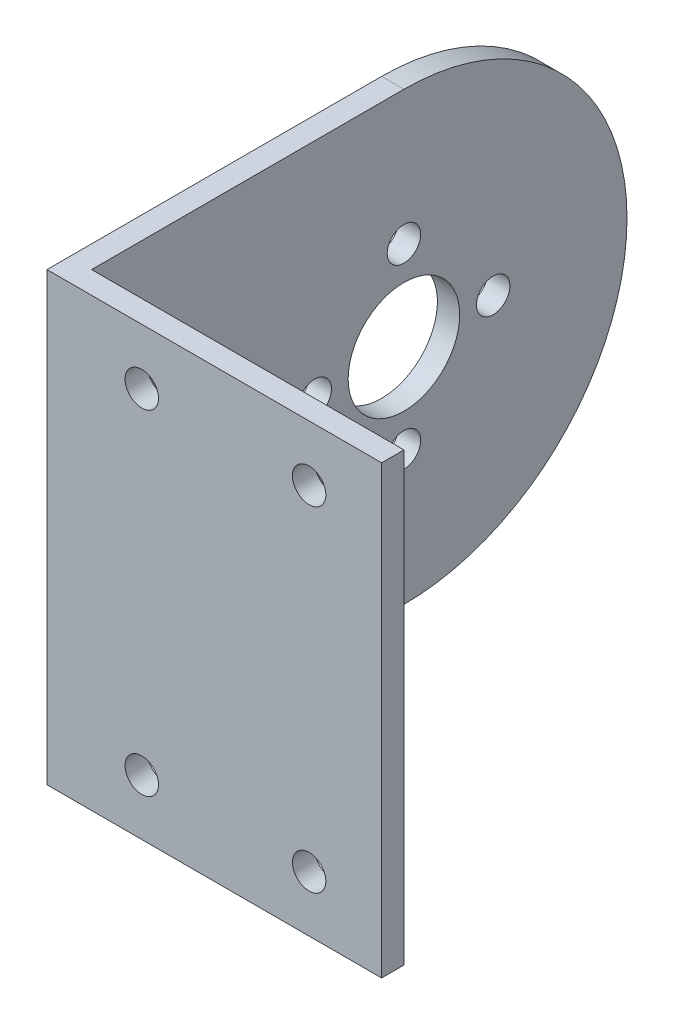
ISO-10303-21;
HEADER;
FILE_DESCRIPTION(('STEP AP214'),'2;1');
FILE_NAME('part.step','',(''),(''),'','','');
FILE_SCHEMA(('AUTOMOTIVE_DESIGN { 1 0 10303 214 1 1 1 1 }'));
ENDSEC;
DATA;
#1=APPLICATION_CONTEXT('core data for automotive mechanical design processes');
#2=APPLICATION_PROTOCOL_DEFINITION('international standard','automotive_design',2000,#1);
#3=PRODUCT_CONTEXT('',#1,'mechanical');
#4=PRODUCT('Part','Part','',(#3));
#5=PRODUCT_RELATED_PRODUCT_CATEGORY('part','',(#4));
#6=PRODUCT_DEFINITION_FORMATION('','',#4);
#7=PRODUCT_DEFINITION_CONTEXT('part definition',#1,'design');
#8=PRODUCT_DEFINITION('design','',#6,#7);
#9=PRODUCT_DEFINITION_SHAPE('','',#8);
#10=(LENGTH_UNIT() NAMED_UNIT(*) SI_UNIT(.MILLI.,.METRE.));
#11=(NAMED_UNIT(*) PLANE_ANGLE_UNIT() SI_UNIT($,.RADIAN.));
#12=(NAMED_UNIT(*) SI_UNIT($,.STERADIAN.) SOLID_ANGLE_UNIT());
#13=UNCERTAINTY_MEASURE_WITH_UNIT(LENGTH_MEASURE(1.E-05),#10,'distance_accuracy_value','');
#14=(GEOMETRIC_REPRESENTATION_CONTEXT(3) GLOBAL_UNCERTAINTY_ASSIGNED_CONTEXT((#13)) GLOBAL_UNIT_ASSIGNED_CONTEXT((#10,
#11,#12)) REPRESENTATION_CONTEXT('',''));
#15=CARTESIAN_POINT('',(0.,0.,0.));
#16=DIRECTION('',(0.,0.,1.));
#17=DIRECTION('',(1.,0.,0.));
#18=AXIS2_PLACEMENT_3D('',#15,#16,#17);
#19=CARTESIAN_POINT('',(-32.4884792626728,40.,6.03225806451613));
#20=DIRECTION('',(-1.,0.,0.));
#21=DIRECTION('',(0.,0.,1.));
#22=AXIS2_PLACEMENT_3D('',#19,#20,#21);
#23=PLANE('',#22);
#24=CARTESIAN_POINT('',(-32.4884792626727,20.,-31.9677419354838));
#25=DIRECTION('',(-1.,0.,0.));
#26=DIRECTION('',(0.,0.,1.));
#27=AXIS2_PLACEMENT_3D('',#24,#25,#26);
#28=CIRCLE('',#27,1.50000000000008);
#29=CARTESIAN_POINT('',(-32.4884792626727,20.,-30.4677419354837));
#30=VERTEX_POINT('',#29);
#31=EDGE_CURVE('E167',#30,#30,#28,.T.);
#32=ORIENTED_EDGE('',*,*,#31,.F.);
#33=EDGE_LOOP('',(#32));
#34=FACE_BOUND('',#33,.T.);
#35=CARTESIAN_POINT('',(-32.4884792626727,27.9999999999999,-23.9677419354838));
#36=DIRECTION('',(-1.,0.,0.));
#37=DIRECTION('',(0.,0.,1.));
#38=AXIS2_PLACEMENT_3D('',#35,#36,#37);
#39=CIRCLE('',#38,1.50000000000011);
#40=CARTESIAN_POINT('',(-32.4884792626727,27.9999999999999,-22.4677419354837));
#41=VERTEX_POINT('',#40);
#42=EDGE_CURVE('E187',#41,#41,#39,.T.);
#43=ORIENTED_EDGE('',*,*,#42,.F.);
#44=EDGE_LOOP('',(#43));
#45=FACE_BOUND('',#44,.T.);
#46=CARTESIAN_POINT('',(-32.4884792626727,19.9999999999999,-15.9677419354838));
#47=DIRECTION('',(-1.,0.,0.));
#48=DIRECTION('',(0.,0.,1.));
#49=AXIS2_PLACEMENT_3D('',#46,#47,#48);
#50=CIRCLE('',#49,1.50000000000008);
#51=CARTESIAN_POINT('',(-32.4884792626727,19.9999999999999,-14.4677419354837));
#52=VERTEX_POINT('',#51);
#53=EDGE_CURVE('E183',#52,#52,#50,.T.);
#54=ORIENTED_EDGE('',*,*,#53,.F.);
#55=EDGE_LOOP('',(#54));
#56=FACE_BOUND('',#55,.T.);
#57=CARTESIAN_POINT('',(-32.4884792626727,11.9999999999999,-23.967741935484));
#58=DIRECTION('',(-1.,0.,0.));
#59=DIRECTION('',(0.,0.,1.));
#60=AXIS2_PLACEMENT_3D('',#57,#58,#59);
#61=CIRCLE('',#60,1.50000000000004);
#62=CARTESIAN_POINT('',(-32.4884792626727,11.9999999999999,-22.467741935484));
#63=VERTEX_POINT('',#62);
#64=EDGE_CURVE('E180',#63,#63,#61,.T.);
#65=ORIENTED_EDGE('',*,*,#64,.F.);
#66=EDGE_LOOP('',(#65));
#67=FACE_BOUND('',#66,.T.);
#68=CARTESIAN_POINT('',(-32.4884792626728,20.,-23.9677419354838));
#69=DIRECTION('',(-1.,0.,0.));
#70=DIRECTION('',(0.,0.,1.));
#71=AXIS2_PLACEMENT_3D('',#68,#69,#70);
#72=CIRCLE('',#71,5.);
#73=CARTESIAN_POINT('',(-32.4884792626728,20.,-18.9677419354838));
#74=VERTEX_POINT('',#73);
#75=EDGE_CURVE('E162',#74,#74,#72,.T.);
#76=ORIENTED_EDGE('',*,*,#75,.F.);
#77=EDGE_LOOP('',(#76));
#78=FACE_BOUND('',#77,.T.);
#79=DIRECTION('',(0.,0.,-1.));
#80=VECTOR('',#79,1.);
#81=CARTESIAN_POINT('',(-32.4884792626728,40.,6.03225806451613));
#82=LINE('',#81,#80);
#83=CARTESIAN_POINT('',(-32.4884792626728,40.,6.03225806451613));
#84=VERTEX_POINT('',#83);
#85=CARTESIAN_POINT('',(-32.4884792626728,40.,-23.9677419354839));
#86=VERTEX_POINT('',#85);
#87=EDGE_CURVE('E119',#84,#86,#82,.T.);
#88=ORIENTED_EDGE('',*,*,#87,.T.);
#89=CARTESIAN_POINT('',(-32.4884792626728,20.,-23.9677419354839));
#90=DIRECTION('',(-1.,0.,0.));
#91=DIRECTION('',(0.,0.,1.));
#92=AXIS2_PLACEMENT_3D('',#89,#90,#91);
#93=CIRCLE('',#92,20.);
#94=CARTESIAN_POINT('',(-32.4884792626728,20.,-43.9677419354839));
#95=VERTEX_POINT('',#94);
#96=EDGE_CURVE('E49',#86,#95,#93,.T.);
#97=ORIENTED_EDGE('',*,*,#96,.T.);
#98=CARTESIAN_POINT('',(-32.4884792626728,20.,-23.9677419354839));
#99=DIRECTION('',(-1.,0.,0.));
#100=DIRECTION('',(0.,0.,1.));
#101=AXIS2_PLACEMENT_3D('',#98,#99,#100);
#102=CIRCLE('',#101,20.);
#103=CARTESIAN_POINT('',(-32.4884792626728,0.,-23.9677419354839));
#104=VERTEX_POINT('',#103);
#105=EDGE_CURVE('E60',#95,#104,#102,.T.);
#106=ORIENTED_EDGE('',*,*,#105,.T.);
#107=DIRECTION('',(0.,0.,-1.));
#108=VECTOR('',#107,1.);
#109=CARTESIAN_POINT('',(-32.4884792626728,0.,6.03225806451613));
#110=LINE('',#109,#108);
#111=CARTESIAN_POINT('',(-32.4884792626728,0.,6.03225806451613));
#112=VERTEX_POINT('',#111);
#113=EDGE_CURVE('E111',#112,#104,#110,.T.);
#114=ORIENTED_EDGE('',*,*,#113,.F.);
#115=DIRECTION('',(0.,-1.,0.));
#116=VECTOR('',#115,1.);
#117=CARTESIAN_POINT('',(-32.4884792626728,40.,6.03225806451613));
#118=LINE('',#117,#116);
#119=EDGE_CURVE('E145',#84,#112,#118,.T.);
#120=ORIENTED_EDGE('',*,*,#119,.F.);
#121=EDGE_LOOP('',(#88,#97,#106,#114,#120));
#122=FACE_BOUND('',#121,.T.);
#123=ADVANCED_FACE('F40',(#34,#45,#56,#67,#78,#122),#23,.T.);
#124=CARTESIAN_POINT('',(-2.48847926267281,40.,6.03225806451613));
#125=DIRECTION('',(0.,0.,1.));
#126=DIRECTION('',(1.,0.,0.));
#127=AXIS2_PLACEMENT_3D('',#124,#125,#126);
#128=PLANE('',#127);
#129=CARTESIAN_POINT('',(-23.9884792626728,5.00000000000001,6.03225806451613));
#130=DIRECTION('',(0.,0.,1.));
#131=DIRECTION('',(1.,0.,0.));
#132=AXIS2_PLACEMENT_3D('',#129,#130,#131);
#133=CIRCLE('',#132,1.5);
#134=CARTESIAN_POINT('',(-22.4884792626728,5.00000000000001,6.03225806451613));
#135=VERTEX_POINT('',#134);
#136=EDGE_CURVE('E184',#135,#135,#133,.T.);
#137=ORIENTED_EDGE('',*,*,#136,.F.);
#138=EDGE_LOOP('',(#137));
#139=FACE_BOUND('',#138,.T.);
#140=CARTESIAN_POINT('',(-8.98847926267281,35.,6.03225806451613));
#141=DIRECTION('',(0.,0.,1.));
#142=DIRECTION('',(1.,0.,0.));
#143=AXIS2_PLACEMENT_3D('',#140,#141,#142);
#144=CIRCLE('',#143,1.5);
#145=CARTESIAN_POINT('',(-7.48847926267281,35.,6.03225806451613));
#146=VERTEX_POINT('',#145);
#147=EDGE_CURVE('E194',#146,#146,#144,.T.);
#148=ORIENTED_EDGE('',*,*,#147,.F.);
#149=EDGE_LOOP('',(#148));
#150=FACE_BOUND('',#149,.T.);
#151=CARTESIAN_POINT('',(-8.98847926267281,5.,6.03225806451613));
#152=DIRECTION('',(0.,0.,1.));
#153=DIRECTION('',(1.,0.,0.));
#154=AXIS2_PLACEMENT_3D('',#151,#152,#153);
#155=CIRCLE('',#154,1.5);
#156=CARTESIAN_POINT('',(-7.48847926267281,5.,6.03225806451613));
#157=VERTEX_POINT('',#156);
#158=EDGE_CURVE('E197',#157,#157,#155,.T.);
#159=ORIENTED_EDGE('',*,*,#158,.F.);
#160=EDGE_LOOP('',(#159));
#161=FACE_BOUND('',#160,.T.);
#162=CARTESIAN_POINT('',(-23.9884792626728,35.,6.03225806451613));
#163=DIRECTION('',(0.,0.,1.));
#164=DIRECTION('',(1.,0.,0.));
#165=AXIS2_PLACEMENT_3D('',#162,#163,#164);
#166=CIRCLE('',#165,1.5);
#167=CARTESIAN_POINT('',(-22.4884792626728,35.,6.03225806451613));
#168=VERTEX_POINT('',#167);
#169=EDGE_CURVE('E200',#168,#168,#166,.T.);
#170=ORIENTED_EDGE('',*,*,#169,.F.);
#171=EDGE_LOOP('',(#170));
#172=FACE_BOUND('',#171,.T.);
#173=DIRECTION('',(-1.,0.,0.));
#174=VECTOR('',#173,1.);
#175=CARTESIAN_POINT('',(-2.48847926267281,0.,6.03225806451613));
#176=LINE('',#175,#174);
#177=CARTESIAN_POINT('',(-2.48847926267281,0.,6.03225806451613));
#178=VERTEX_POINT('',#177);
#179=EDGE_CURVE('E141',#178,#112,#176,.T.);
#180=ORIENTED_EDGE('',*,*,#179,.F.);
#181=DIRECTION('',(0.,-1.,0.));
#182=VECTOR('',#181,1.);
#183=CARTESIAN_POINT('',(-2.48847926267281,40.,6.03225806451613));
#184=LINE('',#183,#182);
#185=CARTESIAN_POINT('',(-2.48847926267281,40.,6.03225806451613));
#186=VERTEX_POINT('',#185);
#187=EDGE_CURVE('E148',#186,#178,#184,.T.);
#188=ORIENTED_EDGE('',*,*,#187,.F.);
#189=DIRECTION('',(-1.,0.,0.));
#190=VECTOR('',#189,1.);
#191=CARTESIAN_POINT('',(-2.48847926267281,40.,6.03225806451613));
#192=LINE('',#191,#190);
#193=EDGE_CURVE('E127',#186,#84,#192,.T.);
#194=ORIENTED_EDGE('',*,*,#193,.T.);
#195=ORIENTED_EDGE('',*,*,#119,.T.);
#196=EDGE_LOOP('',(#180,#188,#194,#195));
#197=FACE_BOUND('',#196,.T.);
#198=ADVANCED_FACE('F241',(#139,#150,#161,#172,#197),#128,.T.);
#199=CARTESIAN_POINT('',(-2.48847926267281,40.,4.03225806451613));
#200=DIRECTION('',(1.,0.,0.));
#201=DIRECTION('',(0.,0.,-1.));
#202=AXIS2_PLACEMENT_3D('',#199,#200,#201);
#203=PLANE('',#202);
#204=DIRECTION('',(0.,0.,1.));
#205=VECTOR('',#204,1.);
#206=CARTESIAN_POINT('',(-2.48847926267281,0.,4.03225806451613));
#207=LINE('',#206,#205);
#208=CARTESIAN_POINT('',(-2.48847926267281,0.,4.03225806451613));
#209=VERTEX_POINT('',#208);
#210=EDGE_CURVE('E138',#209,#178,#207,.T.);
#211=ORIENTED_EDGE('',*,*,#210,.F.);
#212=DIRECTION('',(0.,-1.,0.));
#213=VECTOR('',#212,1.);
#214=CARTESIAN_POINT('',(-2.48847926267281,40.,4.03225806451613));
#215=LINE('',#214,#213);
#216=CARTESIAN_POINT('',(-2.48847926267281,40.,4.03225806451613));
#217=VERTEX_POINT('',#216);
#218=EDGE_CURVE('E118',#217,#209,#215,.T.);
#219=ORIENTED_EDGE('',*,*,#218,.F.);
#220=DIRECTION('',(0.,0.,1.));
#221=VECTOR('',#220,1.);
#222=CARTESIAN_POINT('',(-2.48847926267281,40.,4.03225806451613));
#223=LINE('',#222,#221);
#224=EDGE_CURVE('E125',#217,#186,#223,.T.);
#225=ORIENTED_EDGE('',*,*,#224,.T.);
#226=ORIENTED_EDGE('',*,*,#187,.T.);
#227=EDGE_LOOP('',(#211,#219,#225,#226));
#228=FACE_BOUND('',#227,.T.);
#229=ADVANCED_FACE('F220',(#228),#203,.T.);
#230=CARTESIAN_POINT('',(-30.4884792626728,40.,4.03225806451613));
#231=DIRECTION('',(0.,0.,-1.));
#232=DIRECTION('',(-1.,0.,0.));
#233=AXIS2_PLACEMENT_3D('',#230,#231,#232);
#234=PLANE('',#233);
#235=CARTESIAN_POINT('',(-23.9884792626728,5.00000000000001,4.03225806451613));
#236=DIRECTION('',(0.,0.,-1.));
#237=DIRECTION('',(-1.,0.,0.));
#238=AXIS2_PLACEMENT_3D('',#235,#236,#237);
#239=CIRCLE('',#238,1.5);
#240=CARTESIAN_POINT('',(-25.4884792626728,5.00000000000001,4.03225806451613));
#241=VERTEX_POINT('',#240);
#242=EDGE_CURVE('E206',#241,#241,#239,.T.);
#243=ORIENTED_EDGE('',*,*,#242,.F.);
#244=EDGE_LOOP('',(#243));
#245=FACE_BOUND('',#244,.T.);
#246=CARTESIAN_POINT('',(-8.98847926267281,35.,4.03225806451613));
#247=DIRECTION('',(0.,0.,-1.));
#248=DIRECTION('',(-1.,0.,0.));
#249=AXIS2_PLACEMENT_3D('',#246,#247,#248);
#250=CIRCLE('',#249,1.5);
#251=CARTESIAN_POINT('',(-10.4884792626728,35.,4.03225806451613));
#252=VERTEX_POINT('',#251);
#253=EDGE_CURVE('E207',#252,#252,#250,.T.);
#254=ORIENTED_EDGE('',*,*,#253,.F.);
#255=EDGE_LOOP('',(#254));
#256=FACE_BOUND('',#255,.T.);
#257=CARTESIAN_POINT('',(-8.98847926267281,5.,4.03225806451613));
#258=DIRECTION('',(0.,0.,-1.));
#259=DIRECTION('',(-1.,0.,0.));
#260=AXIS2_PLACEMENT_3D('',#257,#258,#259);
#261=CIRCLE('',#260,1.5);
#262=CARTESIAN_POINT('',(-10.4884792626728,5.,4.03225806451613));
#263=VERTEX_POINT('',#262);
#264=EDGE_CURVE('E210',#263,#263,#261,.T.);
#265=ORIENTED_EDGE('',*,*,#264,.F.);
#266=EDGE_LOOP('',(#265));
#267=FACE_BOUND('',#266,.T.);
#268=CARTESIAN_POINT('',(-23.9884792626728,35.,4.03225806451613));
#269=DIRECTION('',(0.,0.,-1.));
#270=DIRECTION('',(-1.,0.,0.));
#271=AXIS2_PLACEMENT_3D('',#268,#269,#270);
#272=CIRCLE('',#271,1.5);
#273=CARTESIAN_POINT('',(-25.4884792626728,35.,4.03225806451613));
#274=VERTEX_POINT('',#273);
#275=EDGE_CURVE('E203',#274,#274,#272,.T.);
#276=ORIENTED_EDGE('',*,*,#275,.F.);
#277=EDGE_LOOP('',(#276));
#278=FACE_BOUND('',#277,.T.);
#279=DIRECTION('',(1.,0.,0.));
#280=VECTOR('',#279,1.);
#281=CARTESIAN_POINT('',(-30.4884792626728,0.,4.03225806451613));
#282=LINE('',#281,#280);
#283=CARTESIAN_POINT('',(-30.4884792626728,0.,4.03225806451613));
#284=VERTEX_POINT('',#283);
#285=EDGE_CURVE('E117',#284,#209,#282,.T.);
#286=ORIENTED_EDGE('',*,*,#285,.F.);
#287=DIRECTION('',(0.,-1.,0.));
#288=VECTOR('',#287,1.);
#289=CARTESIAN_POINT('',(-30.4884792626728,40.,4.03225806451613));
#290=LINE('',#289,#288);
#291=CARTESIAN_POINT('',(-30.4884792626728,40.,4.03225806451613));
#292=VERTEX_POINT('',#291);
#293=EDGE_CURVE('E102',#292,#284,#290,.T.);
#294=ORIENTED_EDGE('',*,*,#293,.F.);
#295=DIRECTION('',(1.,0.,0.));
#296=VECTOR('',#295,1.);
#297=CARTESIAN_POINT('',(-30.4884792626728,40.,4.03225806451613));
#298=LINE('',#297,#296);
#299=EDGE_CURVE('E110',#292,#217,#298,.T.);
#300=ORIENTED_EDGE('',*,*,#299,.T.);
#301=ORIENTED_EDGE('',*,*,#218,.T.);
#302=EDGE_LOOP('',(#286,#294,#300,#301));
#303=FACE_BOUND('',#302,.T.);
#304=ADVANCED_FACE('F115',(#245,#256,#267,#278,#303),#234,.T.);
#305=CARTESIAN_POINT('',(-30.4884792626728,40.,-43.9677419354839));
#306=DIRECTION('',(1.,0.,0.));
#307=DIRECTION('',(0.,0.,-1.));
#308=AXIS2_PLACEMENT_3D('',#305,#306,#307);
#309=PLANE('',#308);
#310=CARTESIAN_POINT('',(-30.4884792626728,20.,-31.9677419354838));
#311=DIRECTION('',(1.,0.,0.));
#312=DIRECTION('',(0.,0.,-1.));
#313=AXIS2_PLACEMENT_3D('',#310,#311,#312);
#314=CIRCLE('',#313,1.50000000000008);
#315=CARTESIAN_POINT('',(-30.4884792626728,20.,-33.4677419354839));
#316=VERTEX_POINT('',#315);
#317=EDGE_CURVE('E44',#316,#316,#314,.T.);
#318=ORIENTED_EDGE('',*,*,#317,.F.);
#319=EDGE_LOOP('',(#318));
#320=FACE_BOUND('',#319,.T.);
#321=CARTESIAN_POINT('',(-30.4884792626728,27.9999999999999,-23.9677419354838));
#322=DIRECTION('',(1.,0.,0.));
#323=DIRECTION('',(0.,0.,-1.));
#324=AXIS2_PLACEMENT_3D('',#321,#322,#323);
#325=CIRCLE('',#324,1.50000000000011);
#326=CARTESIAN_POINT('',(-30.4884792626728,27.9999999999999,-25.4677419354839));
#327=VERTEX_POINT('',#326);
#328=EDGE_CURVE('E169',#327,#327,#325,.T.);
#329=ORIENTED_EDGE('',*,*,#328,.F.);
#330=EDGE_LOOP('',(#329));
#331=FACE_BOUND('',#330,.T.);
#332=CARTESIAN_POINT('',(-30.4884792626728,19.9999999999999,-15.9677419354838));
#333=DIRECTION('',(1.,0.,0.));
#334=DIRECTION('',(0.,0.,-1.));
#335=AXIS2_PLACEMENT_3D('',#332,#333,#334);
#336=CIRCLE('',#335,1.50000000000008);
#337=CARTESIAN_POINT('',(-30.4884792626728,19.9999999999999,-17.4677419354839));
#338=VERTEX_POINT('',#337);
#339=EDGE_CURVE('E166',#338,#338,#336,.T.);
#340=ORIENTED_EDGE('',*,*,#339,.F.);
#341=EDGE_LOOP('',(#340));
#342=FACE_BOUND('',#341,.T.);
#343=CARTESIAN_POINT('',(-30.4884792626728,11.9999999999999,-23.967741935484));
#344=DIRECTION('',(1.,0.,0.));
#345=DIRECTION('',(0.,0.,-1.));
#346=AXIS2_PLACEMENT_3D('',#343,#344,#345);
#347=CIRCLE('',#346,1.50000000000004);
#348=CARTESIAN_POINT('',(-30.4884792626728,11.9999999999999,-25.4677419354841));
#349=VERTEX_POINT('',#348);
#350=EDGE_CURVE('E163',#349,#349,#347,.T.);
#351=ORIENTED_EDGE('',*,*,#350,.F.);
#352=EDGE_LOOP('',(#351));
#353=FACE_BOUND('',#352,.T.);
#354=CARTESIAN_POINT('',(-30.4884792626728,20.,-23.9677419354838));
#355=DIRECTION('',(1.,0.,0.));
#356=DIRECTION('',(0.,0.,-1.));
#357=AXIS2_PLACEMENT_3D('',#354,#355,#356);
#358=CIRCLE('',#357,5.);
#359=CARTESIAN_POINT('',(-30.4884792626728,20.,-28.9677419354838));
#360=VERTEX_POINT('',#359);
#361=EDGE_CURVE('E159',#360,#360,#358,.T.);
#362=ORIENTED_EDGE('',*,*,#361,.F.);
#363=EDGE_LOOP('',(#362));
#364=FACE_BOUND('',#363,.T.);
#365=CARTESIAN_POINT('',(-30.4884792626728,20.,-23.9677419354839));
#366=DIRECTION('',(1.,0.,0.));
#367=DIRECTION('',(0.,0.,-1.));
#368=AXIS2_PLACEMENT_3D('',#365,#366,#367);
#369=CIRCLE('',#368,20.);
#370=CARTESIAN_POINT('',(-30.4884792626728,0.,-23.9677419354839));
#371=VERTEX_POINT('',#370);
#372=CARTESIAN_POINT('',(-30.4884792626728,20.,-43.9677419354839));
#373=VERTEX_POINT('',#372);
#374=EDGE_CURVE('E147',#371,#373,#369,.T.);
#375=ORIENTED_EDGE('',*,*,#374,.T.);
#376=CARTESIAN_POINT('',(-30.4884792626728,20.,-23.9677419354839));
#377=DIRECTION('',(1.,0.,0.));
#378=DIRECTION('',(0.,0.,-1.));
#379=AXIS2_PLACEMENT_3D('',#376,#377,#378);
#380=CIRCLE('',#379,20.);
#381=CARTESIAN_POINT('',(-30.4884792626728,40.,-23.9677419354839));
#382=VERTEX_POINT('',#381);
#383=EDGE_CURVE('E105',#373,#382,#380,.T.);
#384=ORIENTED_EDGE('',*,*,#383,.T.);
#385=DIRECTION('',(0.,0.,1.));
#386=VECTOR('',#385,1.);
#387=CARTESIAN_POINT('',(-30.4884792626728,40.,-43.9677419354839));
#388=LINE('',#387,#386);
#389=EDGE_CURVE('E98',#382,#292,#388,.T.);
#390=ORIENTED_EDGE('',*,*,#389,.T.);
#391=ORIENTED_EDGE('',*,*,#293,.T.);
#392=DIRECTION('',(0.,0.,1.));
#393=VECTOR('',#392,1.);
#394=CARTESIAN_POINT('',(-30.4884792626728,0.,-43.9677419354839));
#395=LINE('',#394,#393);
#396=EDGE_CURVE('E134',#371,#284,#395,.T.);
#397=ORIENTED_EDGE('',*,*,#396,.F.);
#398=EDGE_LOOP('',(#375,#384,#390,#391,#397));
#399=FACE_BOUND('',#398,.T.);
#400=ADVANCED_FACE('F100',(#320,#331,#342,#353,#364,#399),#309,.T.);
#401=CARTESIAN_POINT('',(0.,40.,0.));
#402=DIRECTION('',(0.,-1.,0.));
#403=DIRECTION('',(0.,0.,-1.));
#404=AXIS2_PLACEMENT_3D('',#401,#402,#403);
#405=PLANE('',#404);
#406=ORIENTED_EDGE('',*,*,#389,.F.);
#407=DIRECTION('',(1.,0.,0.));
#408=VECTOR('',#407,1.);
#409=CARTESIAN_POINT('',(-32.4884792626728,40.,-23.9677419354839));
#410=LINE('',#409,#408);
#411=EDGE_CURVE('E153',#382,#86,#410,.F.);
#412=ORIENTED_EDGE('',*,*,#411,.T.);
#413=ORIENTED_EDGE('',*,*,#87,.F.);
#414=ORIENTED_EDGE('',*,*,#193,.F.);
#415=ORIENTED_EDGE('',*,*,#224,.F.);
#416=ORIENTED_EDGE('',*,*,#299,.F.);
#417=EDGE_LOOP('',(#406,#412,#413,#414,#415,#416));
#418=FACE_BOUND('',#417,.T.);
#419=ADVANCED_FACE('F122',(#418),#405,.F.);
#420=CARTESIAN_POINT('',(0.,0.,0.));
#421=DIRECTION('',(0.,-1.,0.));
#422=DIRECTION('',(0.,0.,-1.));
#423=AXIS2_PLACEMENT_3D('',#420,#421,#422);
#424=PLANE('',#423);
#425=ORIENTED_EDGE('',*,*,#113,.T.);
#426=DIRECTION('',(1.,0.,0.));
#427=VECTOR('',#426,1.);
#428=CARTESIAN_POINT('',(0.,0.,-23.9677419354839));
#429=LINE('',#428,#427);
#430=EDGE_CURVE('E11',#104,#371,#429,.T.);
#431=ORIENTED_EDGE('',*,*,#430,.T.);
#432=ORIENTED_EDGE('',*,*,#396,.T.);
#433=ORIENTED_EDGE('',*,*,#285,.T.);
#434=ORIENTED_EDGE('',*,*,#210,.T.);
#435=ORIENTED_EDGE('',*,*,#179,.T.);
#436=EDGE_LOOP('',(#425,#431,#432,#433,#434,#435));
#437=FACE_BOUND('',#436,.T.);
#438=ADVANCED_FACE('F254',(#437),#424,.T.);
#439=CARTESIAN_POINT('',(0.,20.,-23.9677419354839));
#440=DIRECTION('',(1.,0.,0.));
#441=DIRECTION('',(0.,0.,-1.));
#442=AXIS2_PLACEMENT_3D('',#439,#440,#441);
#443=CYLINDRICAL_SURFACE('',#442,20.);
#444=ORIENTED_EDGE('',*,*,#430,.F.);
#445=ORIENTED_EDGE('',*,*,#105,.F.);
#446=DIRECTION('',(1.,0.,0.));
#447=VECTOR('',#446,1.);
#448=CARTESIAN_POINT('',(-32.4884792626728,20.,-43.9677419354839));
#449=LINE('',#448,#447);
#450=EDGE_CURVE('E136',#373,#95,#449,.F.);
#451=ORIENTED_EDGE('',*,*,#450,.F.);
#452=ORIENTED_EDGE('',*,*,#374,.F.);
#453=EDGE_LOOP('',(#444,#445,#451,#452));
#454=FACE_BOUND('',#453,.T.);
#455=ADVANCED_FACE('F42',(#454),#443,.T.);
#456=CARTESIAN_POINT('',(-32.4884792626728,20.,-23.9677419354839));
#457=DIRECTION('',(-1.,0.,0.));
#458=DIRECTION('',(0.,0.,1.));
#459=AXIS2_PLACEMENT_3D('',#456,#457,#458);
#460=CYLINDRICAL_SURFACE('',#459,20.);
#461=ORIENTED_EDGE('',*,*,#96,.F.);
#462=ORIENTED_EDGE('',*,*,#411,.F.);
#463=ORIENTED_EDGE('',*,*,#383,.F.);
#464=ORIENTED_EDGE('',*,*,#450,.T.);
#465=EDGE_LOOP('',(#461,#462,#463,#464));
#466=FACE_BOUND('',#465,.T.);
#467=ADVANCED_FACE('F261',(#466),#460,.T.);
#468=CARTESIAN_POINT('',(-22.4884792626728,20.,-23.9677419354838));
#469=DIRECTION('',(-1.,0.,0.));
#470=DIRECTION('',(0.,0.,1.));
#471=AXIS2_PLACEMENT_3D('',#468,#469,#470);
#472=CYLINDRICAL_SURFACE('',#471,5.);
#473=ORIENTED_EDGE('',*,*,#361,.T.);
#474=EDGE_LOOP('',(#473));
#475=FACE_BOUND('',#474,.T.);
#476=ORIENTED_EDGE('',*,*,#75,.T.);
#477=EDGE_LOOP('',(#476));
#478=FACE_BOUND('',#477,.T.);
#479=ADVANCED_FACE('F263',(#475,#478),#472,.F.);
#480=CARTESIAN_POINT('',(-22.4884792626727,11.9999999999999,-23.967741935484));
#481=DIRECTION('',(-1.,0.,0.));
#482=DIRECTION('',(0.,0.,1.));
#483=AXIS2_PLACEMENT_3D('',#480,#481,#482);
#484=CYLINDRICAL_SURFACE('',#483,1.50000000000004);
#485=ORIENTED_EDGE('',*,*,#350,.T.);
#486=EDGE_LOOP('',(#485));
#487=FACE_BOUND('',#486,.T.);
#488=ORIENTED_EDGE('',*,*,#64,.T.);
#489=EDGE_LOOP('',(#488));
#490=FACE_BOUND('',#489,.T.);
#491=ADVANCED_FACE('F268',(#487,#490),#484,.F.);
#492=CARTESIAN_POINT('',(-22.4884792626727,19.9999999999999,-15.9677419354838));
#493=DIRECTION('',(-1.,0.,0.));
#494=DIRECTION('',(0.,0.,1.));
#495=AXIS2_PLACEMENT_3D('',#492,#493,#494);
#496=CYLINDRICAL_SURFACE('',#495,1.50000000000008);
#497=ORIENTED_EDGE('',*,*,#339,.T.);
#498=EDGE_LOOP('',(#497));
#499=FACE_BOUND('',#498,.T.);
#500=ORIENTED_EDGE('',*,*,#53,.T.);
#501=EDGE_LOOP('',(#500));
#502=FACE_BOUND('',#501,.T.);
#503=ADVANCED_FACE('F289',(#499,#502),#496,.F.);
#504=CARTESIAN_POINT('',(-22.4884792626727,27.9999999999999,-23.9677419354838));
#505=DIRECTION('',(-1.,0.,0.));
#506=DIRECTION('',(0.,0.,1.));
#507=AXIS2_PLACEMENT_3D('',#504,#505,#506);
#508=CYLINDRICAL_SURFACE('',#507,1.50000000000011);
#509=ORIENTED_EDGE('',*,*,#328,.T.);
#510=EDGE_LOOP('',(#509));
#511=FACE_BOUND('',#510,.T.);
#512=ORIENTED_EDGE('',*,*,#42,.T.);
#513=EDGE_LOOP('',(#512));
#514=FACE_BOUND('',#513,.T.);
#515=ADVANCED_FACE('F237',(#511,#514),#508,.F.);
#516=CARTESIAN_POINT('',(-22.4884792626727,20.,-31.9677419354838));
#517=DIRECTION('',(-1.,0.,0.));
#518=DIRECTION('',(0.,0.,1.));
#519=AXIS2_PLACEMENT_3D('',#516,#517,#518);
#520=CYLINDRICAL_SURFACE('',#519,1.50000000000008);
#521=ORIENTED_EDGE('',*,*,#317,.T.);
#522=EDGE_LOOP('',(#521));
#523=FACE_BOUND('',#522,.T.);
#524=ORIENTED_EDGE('',*,*,#31,.T.);
#525=EDGE_LOOP('',(#524));
#526=FACE_BOUND('',#525,.T.);
#527=ADVANCED_FACE('F227',(#523,#526),#520,.F.);
#528=CARTESIAN_POINT('',(-23.9884792626728,35.,14.0322580645161));
#529=DIRECTION('',(0.,0.,-1.));
#530=DIRECTION('',(-1.,0.,0.));
#531=AXIS2_PLACEMENT_3D('',#528,#529,#530);
#532=CYLINDRICAL_SURFACE('',#531,1.5);
#533=ORIENTED_EDGE('',*,*,#169,.T.);
#534=EDGE_LOOP('',(#533));
#535=FACE_BOUND('',#534,.T.);
#536=ORIENTED_EDGE('',*,*,#275,.T.);
#537=EDGE_LOOP('',(#536));
#538=FACE_BOUND('',#537,.T.);
#539=ADVANCED_FACE('F225',(#535,#538),#532,.F.);
#540=CARTESIAN_POINT('',(-8.98847926267281,5.,14.0322580645161));
#541=DIRECTION('',(0.,0.,-1.));
#542=DIRECTION('',(-1.,0.,0.));
#543=AXIS2_PLACEMENT_3D('',#540,#541,#542);
#544=CYLINDRICAL_SURFACE('',#543,1.5);
#545=ORIENTED_EDGE('',*,*,#158,.T.);
#546=EDGE_LOOP('',(#545));
#547=FACE_BOUND('',#546,.T.);
#548=ORIENTED_EDGE('',*,*,#264,.T.);
#549=EDGE_LOOP('',(#548));
#550=FACE_BOUND('',#549,.T.);
#551=ADVANCED_FACE('F216',(#547,#550),#544,.F.);
#552=CARTESIAN_POINT('',(-8.98847926267281,35.,14.0322580645161));
#553=DIRECTION('',(0.,0.,-1.));
#554=DIRECTION('',(-1.,0.,0.));
#555=AXIS2_PLACEMENT_3D('',#552,#553,#554);
#556=CYLINDRICAL_SURFACE('',#555,1.5);
#557=ORIENTED_EDGE('',*,*,#147,.T.);
#558=EDGE_LOOP('',(#557));
#559=FACE_BOUND('',#558,.T.);
#560=ORIENTED_EDGE('',*,*,#253,.T.);
#561=EDGE_LOOP('',(#560));
#562=FACE_BOUND('',#561,.T.);
#563=ADVANCED_FACE('F233',(#559,#562),#556,.F.);
#564=CARTESIAN_POINT('',(-23.9884792626728,5.00000000000001,14.0322580645161));
#565=DIRECTION('',(0.,0.,-1.));
#566=DIRECTION('',(-1.,0.,0.));
#567=AXIS2_PLACEMENT_3D('',#564,#565,#566);
#568=CYLINDRICAL_SURFACE('',#567,1.5);
#569=ORIENTED_EDGE('',*,*,#136,.T.);
#570=EDGE_LOOP('',(#569));
#571=FACE_BOUND('',#570,.T.);
#572=ORIENTED_EDGE('',*,*,#242,.T.);
#573=EDGE_LOOP('',(#572));
#574=FACE_BOUND('',#573,.T.);
#575=ADVANCED_FACE('F387',(#571,#574),#568,.F.);
#576=CLOSED_SHELL('',(#123,#198,#229,#304,#400,#419,#438,#455,#467,#479,#491,#503,#515,#527,
#539,#551,#563,#575));
#577=MANIFOLD_SOLID_BREP('B2',#576);
#578=ADVANCED_BREP_SHAPE_REPRESENTATION('',(#18,#577),#14);
#579=SHAPE_DEFINITION_REPRESENTATION(#9,#578);
ENDSEC;
END-ISO-10303-21;
